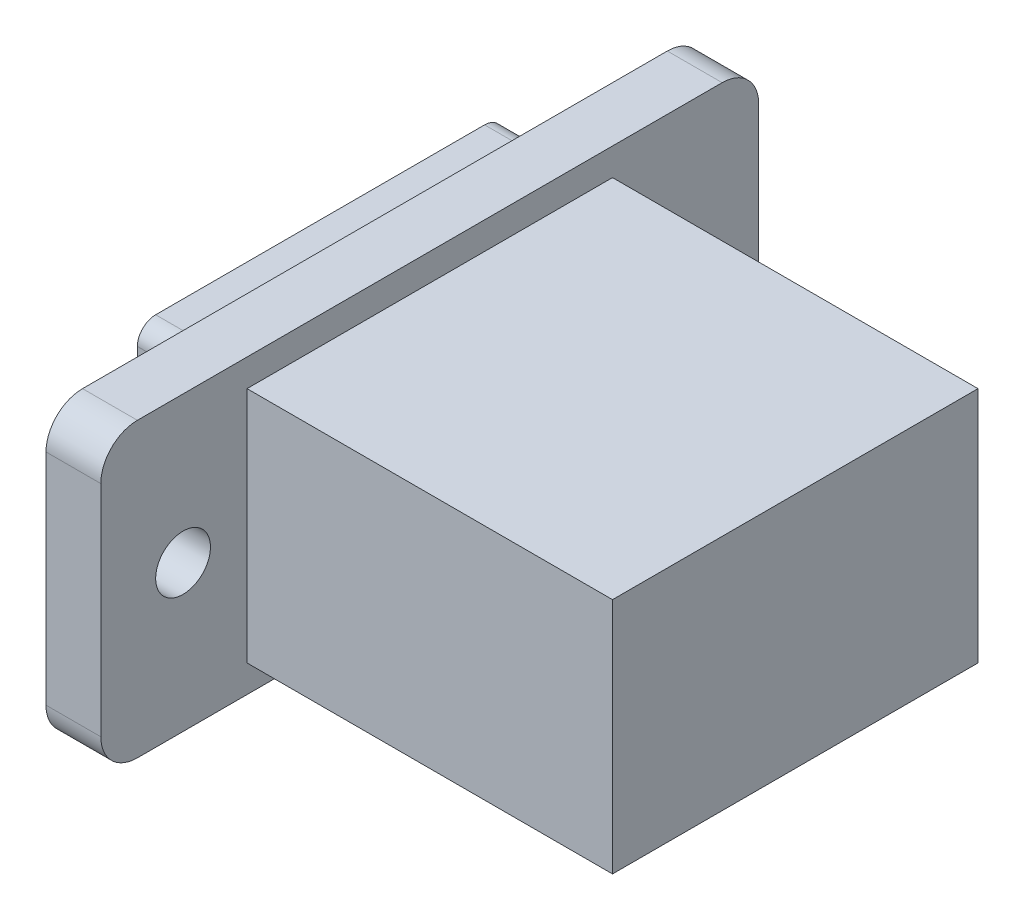
ISO-10303-21;
HEADER;
FILE_DESCRIPTION(('STEP AP214'),'2;1');
FILE_NAME('part.step','',(''),(''),'','','');
FILE_SCHEMA(('AUTOMOTIVE_DESIGN { 1 0 10303 214 1 1 1 1 }'));
ENDSEC;
DATA;
#1=APPLICATION_CONTEXT('core data for automotive mechanical design processes');
#2=APPLICATION_PROTOCOL_DEFINITION('international standard','automotive_design',2000,#1);
#3=PRODUCT_CONTEXT('',#1,'mechanical');
#4=PRODUCT('Part','Part','',(#3));
#5=PRODUCT_RELATED_PRODUCT_CATEGORY('part','',(#4));
#6=PRODUCT_DEFINITION_FORMATION('','',#4);
#7=PRODUCT_DEFINITION_CONTEXT('part definition',#1,'design');
#8=PRODUCT_DEFINITION('design','',#6,#7);
#9=PRODUCT_DEFINITION_SHAPE('','',#8);
#10=(LENGTH_UNIT() NAMED_UNIT(*) SI_UNIT(.MILLI.,.METRE.));
#11=(NAMED_UNIT(*) PLANE_ANGLE_UNIT() SI_UNIT($,.RADIAN.));
#12=(NAMED_UNIT(*) SI_UNIT($,.STERADIAN.) SOLID_ANGLE_UNIT());
#13=UNCERTAINTY_MEASURE_WITH_UNIT(LENGTH_MEASURE(1.E-05),#10,'distance_accuracy_value','');
#14=(GEOMETRIC_REPRESENTATION_CONTEXT(3) GLOBAL_UNCERTAINTY_ASSIGNED_CONTEXT((#13)) GLOBAL_UNIT_ASSIGNED_CONTEXT((#10,
#11,#12)) REPRESENTATION_CONTEXT('',''));
#15=CARTESIAN_POINT('',(0.,0.,0.));
#16=DIRECTION('',(0.,0.,1.));
#17=DIRECTION('',(1.,0.,0.));
#18=AXIS2_PLACEMENT_3D('',#15,#16,#17);
#19=CARTESIAN_POINT('',(3.,0.,0.));
#20=DIRECTION('',(-1.,0.,0.));
#21=DIRECTION('',(0.,0.,1.));
#22=AXIS2_PLACEMENT_3D('',#19,#20,#21);
#23=PLANE('',#22);
#24=CARTESIAN_POINT('',(3.,8.,-31.5));
#25=DIRECTION('',(-1.,0.,0.));
#26=DIRECTION('',(0.,0.,1.));
#27=AXIS2_PLACEMENT_3D('',#24,#25,#26);
#28=CIRCLE('',#27,1.5);
#29=CARTESIAN_POINT('',(3.,8.,-30.));
#30=VERTEX_POINT('',#29);
#31=EDGE_CURVE('E482',#30,#30,#28,.T.);
#32=ORIENTED_EDGE('',*,*,#31,.T.);
#33=EDGE_LOOP('',(#32));
#34=FACE_BOUND('',#33,.T.);
#35=CARTESIAN_POINT('',(3.,8.,-4.49999999999999));
#36=DIRECTION('',(-1.,0.,0.));
#37=DIRECTION('',(0.,0.,1.));
#38=AXIS2_PLACEMENT_3D('',#35,#36,#37);
#39=CIRCLE('',#38,1.5);
#40=CARTESIAN_POINT('',(3.,8.,-2.99999999999999));
#41=VERTEX_POINT('',#40);
#42=EDGE_CURVE('E506',#41,#41,#39,.T.);
#43=ORIENTED_EDGE('',*,*,#42,.T.);
#44=EDGE_LOOP('',(#43));
#45=FACE_BOUND('',#44,.T.);
#46=DIRECTION('',(0.,0.,-1.));
#47=VECTOR('',#46,1.);
#48=CARTESIAN_POINT('',(3.,0.,0.));
#49=LINE('',#48,#47);
#50=CARTESIAN_POINT('',(3.,0.,-2.));
#51=VERTEX_POINT('',#50);
#52=CARTESIAN_POINT('',(3.,0.,-34.));
#53=VERTEX_POINT('',#52);
#54=EDGE_CURVE('E246',#51,#53,#49,.T.);
#55=ORIENTED_EDGE('',*,*,#54,.T.);
#56=CARTESIAN_POINT('',(3.,2.,-34.));
#57=DIRECTION('',(-1.,0.,0.));
#58=DIRECTION('',(0.,0.,1.));
#59=AXIS2_PLACEMENT_3D('',#56,#57,#58);
#60=CIRCLE('',#59,2.);
#61=CARTESIAN_POINT('',(3.,2.,-36.));
#62=VERTEX_POINT('',#61);
#63=EDGE_CURVE('E308',#53,#62,#60,.F.);
#64=ORIENTED_EDGE('',*,*,#63,.T.);
#65=DIRECTION('',(0.,1.,0.));
#66=VECTOR('',#65,1.);
#67=CARTESIAN_POINT('',(3.,0.,-36.));
#68=LINE('',#67,#66);
#69=CARTESIAN_POINT('',(3.,14.,-36.));
#70=VERTEX_POINT('',#69);
#71=EDGE_CURVE('E251',#62,#70,#68,.T.);
#72=ORIENTED_EDGE('',*,*,#71,.T.);
#73=CARTESIAN_POINT('',(3.,14.,-34.));
#74=DIRECTION('',(-1.,0.,0.));
#75=DIRECTION('',(0.,0.,1.));
#76=AXIS2_PLACEMENT_3D('',#73,#74,#75);
#77=CIRCLE('',#76,2.);
#78=CARTESIAN_POINT('',(3.,16.,-34.));
#79=VERTEX_POINT('',#78);
#80=EDGE_CURVE('E305',#70,#79,#77,.F.);
#81=ORIENTED_EDGE('',*,*,#80,.T.);
#82=DIRECTION('',(0.,0.,1.));
#83=VECTOR('',#82,1.);
#84=CARTESIAN_POINT('',(3.,16.,0.));
#85=LINE('',#84,#83);
#86=CARTESIAN_POINT('',(3.,16.,-2.));
#87=VERTEX_POINT('',#86);
#88=EDGE_CURVE('E255',#79,#87,#85,.T.);
#89=ORIENTED_EDGE('',*,*,#88,.T.);
#90=CARTESIAN_POINT('',(3.,14.,-2.));
#91=DIRECTION('',(-1.,0.,0.));
#92=DIRECTION('',(0.,0.,1.));
#93=AXIS2_PLACEMENT_3D('',#90,#91,#92);
#94=CIRCLE('',#93,2.);
#95=CARTESIAN_POINT('',(3.,14.,0.));
#96=VERTEX_POINT('',#95);
#97=EDGE_CURVE('E299',#87,#96,#94,.F.);
#98=ORIENTED_EDGE('',*,*,#97,.T.);
#99=DIRECTION('',(0.,-1.,0.));
#100=VECTOR('',#99,1.);
#101=CARTESIAN_POINT('',(3.,0.,0.));
#102=LINE('',#101,#100);
#103=CARTESIAN_POINT('',(3.,2.,0.));
#104=VERTEX_POINT('',#103);
#105=EDGE_CURVE('E242',#96,#104,#102,.T.);
#106=ORIENTED_EDGE('',*,*,#105,.T.);
#107=CARTESIAN_POINT('',(3.,2.,-2.));
#108=DIRECTION('',(-1.,0.,0.));
#109=DIRECTION('',(0.,0.,1.));
#110=AXIS2_PLACEMENT_3D('',#107,#108,#109);
#111=CIRCLE('',#110,2.);
#112=EDGE_CURVE('E302',#104,#51,#111,.F.);
#113=ORIENTED_EDGE('',*,*,#112,.T.);
#114=EDGE_LOOP('',(#55,#64,#72,#81,#89,#98,#106,#113));
#115=FACE_BOUND('',#114,.T.);
#116=DIRECTION('',(0.,1.,0.));
#117=VECTOR('',#116,1.);
#118=CARTESIAN_POINT('',(3.,14.5,-28.));
#119=LINE('',#118,#117);
#120=CARTESIAN_POINT('',(3.,1.5,-28.));
#121=VERTEX_POINT('',#120);
#122=CARTESIAN_POINT('',(3.,14.5,-28.));
#123=VERTEX_POINT('',#122);
#124=EDGE_CURVE('E202',#121,#123,#119,.T.);
#125=ORIENTED_EDGE('',*,*,#124,.F.);
#126=DIRECTION('',(0.,0.,-1.));
#127=VECTOR('',#126,1.);
#128=CARTESIAN_POINT('',(3.,1.5,-28.));
#129=LINE('',#128,#127);
#130=CARTESIAN_POINT('',(3.,1.5,-8.));
#131=VERTEX_POINT('',#130);
#132=EDGE_CURVE('E199',#131,#121,#129,.T.);
#133=ORIENTED_EDGE('',*,*,#132,.F.);
#134=DIRECTION('',(0.,-1.,0.));
#135=VECTOR('',#134,1.);
#136=CARTESIAN_POINT('',(3.,1.5,-8.));
#137=LINE('',#136,#135);
#138=CARTESIAN_POINT('',(3.,14.5,-8.));
#139=VERTEX_POINT('',#138);
#140=EDGE_CURVE('E490',#139,#131,#137,.T.);
#141=ORIENTED_EDGE('',*,*,#140,.F.);
#142=DIRECTION('',(0.,0.,1.));
#143=VECTOR('',#142,1.);
#144=CARTESIAN_POINT('',(3.,14.5,-8.));
#145=LINE('',#144,#143);
#146=EDGE_CURVE('E480',#123,#139,#145,.T.);
#147=ORIENTED_EDGE('',*,*,#146,.F.);
#148=EDGE_LOOP('',(#125,#133,#141,#147));
#149=FACE_BOUND('',#148,.T.);
#150=ADVANCED_FACE('F39',(#34,#45,#115,#149),#23,.F.);
#151=CARTESIAN_POINT('',(3.,0.,0.));
#152=DIRECTION('',(0.,0.,-1.));
#153=DIRECTION('',(-1.,0.,0.));
#154=AXIS2_PLACEMENT_3D('',#151,#152,#153);
#155=PLANE('',#154);
#156=DIRECTION('',(0.,-1.,0.));
#157=VECTOR('',#156,1.);
#158=CARTESIAN_POINT('',(0.,0.,0.));
#159=LINE('',#158,#157);
#160=CARTESIAN_POINT('',(0.,14.,0.));
#161=VERTEX_POINT('',#160);
#162=CARTESIAN_POINT('',(0.,2.,0.));
#163=VERTEX_POINT('',#162);
#164=EDGE_CURVE('E231',#161,#163,#159,.T.);
#165=ORIENTED_EDGE('',*,*,#164,.T.);
#166=DIRECTION('',(-1.,0.,0.));
#167=VECTOR('',#166,1.);
#168=CARTESIAN_POINT('',(3.,2.,0.));
#169=LINE('',#168,#167);
#170=EDGE_CURVE('E322',#163,#104,#169,.F.);
#171=ORIENTED_EDGE('',*,*,#170,.T.);
#172=ORIENTED_EDGE('',*,*,#105,.F.);
#173=DIRECTION('',(-1.,0.,0.));
#174=VECTOR('',#173,1.);
#175=CARTESIAN_POINT('',(3.,14.,0.));
#176=LINE('',#175,#174);
#177=EDGE_CURVE('E318',#96,#161,#176,.T.);
#178=ORIENTED_EDGE('',*,*,#177,.T.);
#179=EDGE_LOOP('',(#165,#171,#172,#178));
#180=FACE_BOUND('',#179,.T.);
#181=ADVANCED_FACE('F416',(#180),#155,.F.);
#182=CARTESIAN_POINT('',(3.,0.,0.));
#183=DIRECTION('',(0.,1.,0.));
#184=DIRECTION('',(0.,0.,1.));
#185=AXIS2_PLACEMENT_3D('',#182,#183,#184);
#186=PLANE('',#185);
#187=DIRECTION('',(0.,0.,-1.));
#188=VECTOR('',#187,1.);
#189=CARTESIAN_POINT('',(0.,0.,0.));
#190=LINE('',#189,#188);
#191=CARTESIAN_POINT('',(0.,0.,-2.));
#192=VERTEX_POINT('',#191);
#193=CARTESIAN_POINT('',(0.,0.,-34.));
#194=VERTEX_POINT('',#193);
#195=EDGE_CURVE('E263',#192,#194,#190,.T.);
#196=ORIENTED_EDGE('',*,*,#195,.T.);
#197=DIRECTION('',(-1.,0.,0.));
#198=VECTOR('',#197,1.);
#199=CARTESIAN_POINT('',(3.,0.,-34.));
#200=LINE('',#199,#198);
#201=EDGE_CURVE('E296',#194,#53,#200,.F.);
#202=ORIENTED_EDGE('',*,*,#201,.T.);
#203=ORIENTED_EDGE('',*,*,#54,.F.);
#204=DIRECTION('',(-1.,0.,0.));
#205=VECTOR('',#204,1.);
#206=CARTESIAN_POINT('',(3.,0.,-2.));
#207=LINE('',#206,#205);
#208=EDGE_CURVE('E292',#51,#192,#207,.T.);
#209=ORIENTED_EDGE('',*,*,#208,.T.);
#210=EDGE_LOOP('',(#196,#202,#203,#209));
#211=FACE_BOUND('',#210,.T.);
#212=ADVANCED_FACE('F422',(#211),#186,.F.);
#213=CARTESIAN_POINT('',(3.,0.,-36.));
#214=DIRECTION('',(0.,0.,1.));
#215=DIRECTION('',(1.,0.,0.));
#216=AXIS2_PLACEMENT_3D('',#213,#214,#215);
#217=PLANE('',#216);
#218=ORIENTED_EDGE('',*,*,#71,.F.);
#219=DIRECTION('',(-1.,0.,0.));
#220=VECTOR('',#219,1.);
#221=CARTESIAN_POINT('',(3.,2.,-36.));
#222=LINE('',#221,#220);
#223=CARTESIAN_POINT('',(0.,2.,-36.));
#224=VERTEX_POINT('',#223);
#225=EDGE_CURVE('E276',#62,#224,#222,.T.);
#226=ORIENTED_EDGE('',*,*,#225,.T.);
#227=DIRECTION('',(0.,1.,0.));
#228=VECTOR('',#227,1.);
#229=CARTESIAN_POINT('',(0.,0.,-36.));
#230=LINE('',#229,#228);
#231=CARTESIAN_POINT('',(0.,14.,-36.));
#232=VERTEX_POINT('',#231);
#233=EDGE_CURVE('E267',#224,#232,#230,.T.);
#234=ORIENTED_EDGE('',*,*,#233,.T.);
#235=DIRECTION('',(-1.,0.,0.));
#236=VECTOR('',#235,1.);
#237=CARTESIAN_POINT('',(3.,14.,-36.));
#238=LINE('',#237,#236);
#239=EDGE_CURVE('E259',#232,#70,#238,.F.);
#240=ORIENTED_EDGE('',*,*,#239,.T.);
#241=EDGE_LOOP('',(#218,#226,#234,#240));
#242=FACE_BOUND('',#241,.T.);
#243=ADVANCED_FACE('F436',(#242),#217,.F.);
#244=CARTESIAN_POINT('',(3.,16.,0.));
#245=DIRECTION('',(0.,-1.,0.));
#246=DIRECTION('',(0.,0.,-1.));
#247=AXIS2_PLACEMENT_3D('',#244,#245,#246);
#248=PLANE('',#247);
#249=ORIENTED_EDGE('',*,*,#88,.F.);
#250=DIRECTION('',(-1.,0.,0.));
#251=VECTOR('',#250,1.);
#252=CARTESIAN_POINT('',(3.,16.,-34.));
#253=LINE('',#252,#251);
#254=CARTESIAN_POINT('',(0.,16.,-34.));
#255=VERTEX_POINT('',#254);
#256=EDGE_CURVE('E314',#79,#255,#253,.T.);
#257=ORIENTED_EDGE('',*,*,#256,.T.);
#258=DIRECTION('',(0.,0.,1.));
#259=VECTOR('',#258,1.);
#260=CARTESIAN_POINT('',(0.,16.,0.));
#261=LINE('',#260,#259);
#262=CARTESIAN_POINT('',(0.,16.,-2.));
#263=VERTEX_POINT('',#262);
#264=EDGE_CURVE('E247',#255,#263,#261,.T.);
#265=ORIENTED_EDGE('',*,*,#264,.T.);
#266=DIRECTION('',(-1.,0.,0.));
#267=VECTOR('',#266,1.);
#268=CARTESIAN_POINT('',(3.,16.,-2.));
#269=LINE('',#268,#267);
#270=EDGE_CURVE('E311',#263,#87,#269,.F.);
#271=ORIENTED_EDGE('',*,*,#270,.T.);
#272=EDGE_LOOP('',(#249,#257,#265,#271));
#273=FACE_BOUND('',#272,.T.);
#274=ADVANCED_FACE('F432',(#273),#248,.F.);
#275=CARTESIAN_POINT('',(0.,0.,0.));
#276=DIRECTION('',(-1.,0.,0.));
#277=DIRECTION('',(0.,0.,1.));
#278=AXIS2_PLACEMENT_3D('',#275,#276,#277);
#279=PLANE('',#278);
#280=CARTESIAN_POINT('',(0.,8.,-31.5));
#281=DIRECTION('',(-1.,0.,0.));
#282=DIRECTION('',(0.,0.,1.));
#283=AXIS2_PLACEMENT_3D('',#280,#281,#282);
#284=CIRCLE('',#283,1.5);
#285=CARTESIAN_POINT('',(0.,8.,-30.));
#286=VERTEX_POINT('',#285);
#287=EDGE_CURVE('E510',#286,#286,#284,.T.);
#288=ORIENTED_EDGE('',*,*,#287,.F.);
#289=EDGE_LOOP('',(#288));
#290=FACE_BOUND('',#289,.T.);
#291=CARTESIAN_POINT('',(0.,8.,-4.49999999999999));
#292=DIRECTION('',(-1.,0.,0.));
#293=DIRECTION('',(0.,0.,-1.));
#294=AXIS2_PLACEMENT_3D('',#291,#292,#293);
#295=CIRCLE('',#294,1.5);
#296=CARTESIAN_POINT('',(0.,8.,-6.));
#297=VERTEX_POINT('',#296);
#298=EDGE_CURVE('E511',#297,#297,#295,.T.);
#299=ORIENTED_EDGE('',*,*,#298,.F.);
#300=EDGE_LOOP('',(#299));
#301=FACE_BOUND('',#300,.T.);
#302=DIRECTION('',(0.,-1.,0.));
#303=VECTOR('',#302,1.);
#304=CARTESIAN_POINT('',(0.,14.5,-28.));
#305=LINE('',#304,#303);
#306=CARTESIAN_POINT('',(0.,13.5,-28.));
#307=VERTEX_POINT('',#306);
#308=CARTESIAN_POINT('',(0.,2.5,-28.));
#309=VERTEX_POINT('',#308);
#310=EDGE_CURVE('E204',#307,#309,#305,.T.);
#311=ORIENTED_EDGE('',*,*,#310,.F.);
#312=CARTESIAN_POINT('',(0.,13.5,-27.));
#313=DIRECTION('',(-1.,0.,0.));
#314=DIRECTION('',(0.,0.,1.));
#315=AXIS2_PLACEMENT_3D('',#312,#313,#314);
#316=CIRCLE('',#315,1.);
#317=CARTESIAN_POINT('',(0.,14.5,-27.));
#318=VERTEX_POINT('',#317);
#319=EDGE_CURVE('E367',#307,#318,#316,.F.);
#320=ORIENTED_EDGE('',*,*,#319,.T.);
#321=DIRECTION('',(0.,0.,-1.));
#322=VECTOR('',#321,1.);
#323=CARTESIAN_POINT('',(0.,14.5,-28.));
#324=LINE('',#323,#322);
#325=CARTESIAN_POINT('',(0.,14.5,-9.));
#326=VERTEX_POINT('',#325);
#327=EDGE_CURVE('E220',#326,#318,#324,.T.);
#328=ORIENTED_EDGE('',*,*,#327,.F.);
#329=CARTESIAN_POINT('',(0.,13.5,-9.));
#330=DIRECTION('',(-1.,0.,0.));
#331=DIRECTION('',(0.,0.,1.));
#332=AXIS2_PLACEMENT_3D('',#329,#330,#331);
#333=CIRCLE('',#332,1.);
#334=CARTESIAN_POINT('',(0.,13.5,-8.));
#335=VERTEX_POINT('',#334);
#336=EDGE_CURVE('E11',#326,#335,#333,.F.);
#337=ORIENTED_EDGE('',*,*,#336,.T.);
#338=DIRECTION('',(0.,1.,0.));
#339=VECTOR('',#338,1.);
#340=CARTESIAN_POINT('',(0.,14.5,-8.));
#341=LINE('',#340,#339);
#342=CARTESIAN_POINT('',(0.,2.5,-8.));
#343=VERTEX_POINT('',#342);
#344=EDGE_CURVE('E236',#343,#335,#341,.T.);
#345=ORIENTED_EDGE('',*,*,#344,.F.);
#346=CARTESIAN_POINT('',(0.,2.5,-9.));
#347=DIRECTION('',(-1.,0.,0.));
#348=DIRECTION('',(0.,0.,1.));
#349=AXIS2_PLACEMENT_3D('',#346,#347,#348);
#350=CIRCLE('',#349,1.);
#351=CARTESIAN_POINT('',(0.,1.5,-8.99999999999999));
#352=VERTEX_POINT('',#351);
#353=EDGE_CURVE('E48',#343,#352,#350,.F.);
#354=ORIENTED_EDGE('',*,*,#353,.T.);
#355=DIRECTION('',(0.,0.,1.));
#356=VECTOR('',#355,1.);
#357=CARTESIAN_POINT('',(0.,1.5,-28.));
#358=LINE('',#357,#356);
#359=CARTESIAN_POINT('',(0.,1.5,-27.));
#360=VERTEX_POINT('',#359);
#361=EDGE_CURVE('E209',#360,#352,#358,.T.);
#362=ORIENTED_EDGE('',*,*,#361,.F.);
#363=CARTESIAN_POINT('',(0.,2.5,-27.));
#364=DIRECTION('',(-1.,0.,0.));
#365=DIRECTION('',(0.,0.,1.));
#366=AXIS2_PLACEMENT_3D('',#363,#364,#365);
#367=CIRCLE('',#366,1.);
#368=EDGE_CURVE('E364',#360,#309,#367,.F.);
#369=ORIENTED_EDGE('',*,*,#368,.T.);
#370=EDGE_LOOP('',(#311,#320,#328,#337,#345,#354,#362,#369));
#371=FACE_BOUND('',#370,.T.);
#372=ORIENTED_EDGE('',*,*,#233,.F.);
#373=CARTESIAN_POINT('',(0.,2.,-34.));
#374=DIRECTION('',(-1.,0.,0.));
#375=DIRECTION('',(0.,0.,1.));
#376=AXIS2_PLACEMENT_3D('',#373,#374,#375);
#377=CIRCLE('',#376,2.);
#378=EDGE_CURVE('E289',#224,#194,#377,.T.);
#379=ORIENTED_EDGE('',*,*,#378,.T.);
#380=ORIENTED_EDGE('',*,*,#195,.F.);
#381=CARTESIAN_POINT('',(0.,2.,-2.));
#382=DIRECTION('',(-1.,0.,0.));
#383=DIRECTION('',(0.,0.,1.));
#384=AXIS2_PLACEMENT_3D('',#381,#382,#383);
#385=CIRCLE('',#384,2.);
#386=EDGE_CURVE('E283',#192,#163,#385,.T.);
#387=ORIENTED_EDGE('',*,*,#386,.T.);
#388=ORIENTED_EDGE('',*,*,#164,.F.);
#389=CARTESIAN_POINT('',(0.,14.,-2.));
#390=DIRECTION('',(-1.,0.,0.));
#391=DIRECTION('',(0.,0.,1.));
#392=AXIS2_PLACEMENT_3D('',#389,#390,#391);
#393=CIRCLE('',#392,2.);
#394=EDGE_CURVE('E280',#161,#263,#393,.T.);
#395=ORIENTED_EDGE('',*,*,#394,.T.);
#396=ORIENTED_EDGE('',*,*,#264,.F.);
#397=CARTESIAN_POINT('',(0.,14.,-34.));
#398=DIRECTION('',(-1.,0.,0.));
#399=DIRECTION('',(0.,0.,1.));
#400=AXIS2_PLACEMENT_3D('',#397,#398,#399);
#401=CIRCLE('',#400,2.);
#402=EDGE_CURVE('E286',#255,#232,#401,.T.);
#403=ORIENTED_EDGE('',*,*,#402,.T.);
#404=EDGE_LOOP('',(#372,#379,#380,#387,#388,#395,#396,#403));
#405=FACE_BOUND('',#404,.T.);
#406=ADVANCED_FACE('F372',(#290,#301,#371,#405),#279,.T.);
#407=CARTESIAN_POINT('',(-3.,14.5,-28.));
#408=DIRECTION('',(0.,0.,1.));
#409=DIRECTION('',(1.,0.,0.));
#410=AXIS2_PLACEMENT_3D('',#407,#408,#409);
#411=PLANE('',#410);
#412=ORIENTED_EDGE('',*,*,#310,.T.);
#413=DIRECTION('',(1.,0.,0.));
#414=VECTOR('',#413,1.);
#415=CARTESIAN_POINT('',(-3.,2.5,-28.));
#416=LINE('',#415,#414);
#417=CARTESIAN_POINT('',(-3.,2.5,-28.));
#418=VERTEX_POINT('',#417);
#419=EDGE_CURVE('E336',#309,#418,#416,.F.);
#420=ORIENTED_EDGE('',*,*,#419,.T.);
#421=DIRECTION('',(0.,-1.,0.));
#422=VECTOR('',#421,1.);
#423=CARTESIAN_POINT('',(-3.,14.5,-28.));
#424=LINE('',#423,#422);
#425=CARTESIAN_POINT('',(-3.,13.5,-28.));
#426=VERTEX_POINT('',#425);
#427=EDGE_CURVE('E215',#426,#418,#424,.T.);
#428=ORIENTED_EDGE('',*,*,#427,.F.);
#429=DIRECTION('',(1.,0.,0.));
#430=VECTOR('',#429,1.);
#431=CARTESIAN_POINT('',(-3.,13.5,-28.));
#432=LINE('',#431,#430);
#433=EDGE_CURVE('E332',#426,#307,#432,.T.);
#434=ORIENTED_EDGE('',*,*,#433,.T.);
#435=EDGE_LOOP('',(#412,#420,#428,#434));
#436=FACE_BOUND('',#435,.T.);
#437=ADVANCED_FACE('F400',(#436),#411,.F.);
#438=CARTESIAN_POINT('',(-3.,1.5,-28.));
#439=DIRECTION('',(0.,1.,0.));
#440=DIRECTION('',(0.,0.,1.));
#441=AXIS2_PLACEMENT_3D('',#438,#439,#440);
#442=PLANE('',#441);
#443=DIRECTION('',(0.,0.,1.));
#444=VECTOR('',#443,1.);
#445=CARTESIAN_POINT('',(-3.,1.5,-28.));
#446=LINE('',#445,#444);
#447=CARTESIAN_POINT('',(-3.,1.5,-27.));
#448=VERTEX_POINT('',#447);
#449=CARTESIAN_POINT('',(-3.,1.5,-8.99999999999999));
#450=VERTEX_POINT('',#449);
#451=EDGE_CURVE('E219',#448,#450,#446,.T.);
#452=ORIENTED_EDGE('',*,*,#451,.F.);
#453=DIRECTION('',(1.,0.,0.));
#454=VECTOR('',#453,1.);
#455=CARTESIAN_POINT('',(-3.,1.5,-27.));
#456=LINE('',#455,#454);
#457=EDGE_CURVE('E328',#448,#360,#456,.T.);
#458=ORIENTED_EDGE('',*,*,#457,.T.);
#459=ORIENTED_EDGE('',*,*,#361,.T.);
#460=DIRECTION('',(1.,0.,0.));
#461=VECTOR('',#460,1.);
#462=CARTESIAN_POINT('',(-3.,1.5,-8.99999999999999));
#463=LINE('',#462,#461);
#464=EDGE_CURVE('E325',#352,#450,#463,.F.);
#465=ORIENTED_EDGE('',*,*,#464,.T.);
#466=EDGE_LOOP('',(#452,#458,#459,#465));
#467=FACE_BOUND('',#466,.T.);
#468=ADVANCED_FACE('F376',(#467),#442,.F.);
#469=CARTESIAN_POINT('',(-3.,14.5,-8.));
#470=DIRECTION('',(0.,0.,-1.));
#471=DIRECTION('',(0.,1.,0.));
#472=AXIS2_PLACEMENT_3D('',#469,#470,#471);
#473=PLANE('',#472);
#474=DIRECTION('',(0.,1.,0.));
#475=VECTOR('',#474,1.);
#476=CARTESIAN_POINT('',(-3.,14.5,-8.));
#477=LINE('',#476,#475);
#478=CARTESIAN_POINT('',(-3.,2.5,-8.));
#479=VERTEX_POINT('',#478);
#480=CARTESIAN_POINT('',(-3.,13.5,-8.));
#481=VERTEX_POINT('',#480);
#482=EDGE_CURVE('E224',#479,#481,#477,.T.);
#483=ORIENTED_EDGE('',*,*,#482,.F.);
#484=DIRECTION('',(1.,0.,0.));
#485=VECTOR('',#484,1.);
#486=CARTESIAN_POINT('',(-3.,2.5,-8.));
#487=LINE('',#486,#485);
#488=EDGE_CURVE('E361',#479,#343,#487,.T.);
#489=ORIENTED_EDGE('',*,*,#488,.T.);
#490=ORIENTED_EDGE('',*,*,#344,.T.);
#491=DIRECTION('',(1.,0.,0.));
#492=VECTOR('',#491,1.);
#493=CARTESIAN_POINT('',(-3.,13.5,-8.));
#494=LINE('',#493,#492);
#495=EDGE_CURVE('E358',#335,#481,#494,.F.);
#496=ORIENTED_EDGE('',*,*,#495,.T.);
#497=EDGE_LOOP('',(#483,#489,#490,#496));
#498=FACE_BOUND('',#497,.T.);
#499=ADVANCED_FACE('F385',(#498),#473,.F.);
#500=CARTESIAN_POINT('',(-3.,14.5,-28.));
#501=DIRECTION('',(0.,-1.,0.));
#502=DIRECTION('',(0.,0.,-1.));
#503=AXIS2_PLACEMENT_3D('',#500,#501,#502);
#504=PLANE('',#503);
#505=ORIENTED_EDGE('',*,*,#327,.T.);
#506=DIRECTION('',(1.,0.,0.));
#507=VECTOR('',#506,1.);
#508=CARTESIAN_POINT('',(-3.,14.5,-27.));
#509=LINE('',#508,#507);
#510=CARTESIAN_POINT('',(-3.,14.5,-27.));
#511=VERTEX_POINT('',#510);
#512=EDGE_CURVE('E355',#318,#511,#509,.F.);
#513=ORIENTED_EDGE('',*,*,#512,.T.);
#514=DIRECTION('',(0.,0.,-1.));
#515=VECTOR('',#514,1.);
#516=CARTESIAN_POINT('',(-3.,14.5,-28.));
#517=LINE('',#516,#515);
#518=CARTESIAN_POINT('',(-3.,14.5,-9.));
#519=VERTEX_POINT('',#518);
#520=EDGE_CURVE('E228',#519,#511,#517,.T.);
#521=ORIENTED_EDGE('',*,*,#520,.F.);
#522=DIRECTION('',(1.,0.,0.));
#523=VECTOR('',#522,1.);
#524=CARTESIAN_POINT('',(-3.,14.5,-9.));
#525=LINE('',#524,#523);
#526=EDGE_CURVE('E351',#519,#326,#525,.T.);
#527=ORIENTED_EDGE('',*,*,#526,.T.);
#528=EDGE_LOOP('',(#505,#513,#521,#527));
#529=FACE_BOUND('',#528,.T.);
#530=ADVANCED_FACE('F392',(#529),#504,.F.);
#531=CARTESIAN_POINT('',(-3.,0.,0.));
#532=DIRECTION('',(-1.,0.,0.));
#533=DIRECTION('',(0.,0.,1.));
#534=AXIS2_PLACEMENT_3D('',#531,#532,#533);
#535=PLANE('',#534);
#536=ORIENTED_EDGE('',*,*,#427,.T.);
#537=CARTESIAN_POINT('',(-3.,2.5,-27.));
#538=DIRECTION('',(-1.,0.,0.));
#539=DIRECTION('',(0.,0.,1.));
#540=AXIS2_PLACEMENT_3D('',#537,#538,#539);
#541=CIRCLE('',#540,1.);
#542=EDGE_CURVE('E348',#418,#448,#541,.T.);
#543=ORIENTED_EDGE('',*,*,#542,.T.);
#544=ORIENTED_EDGE('',*,*,#451,.T.);
#545=CARTESIAN_POINT('',(-3.,2.5,-9.));
#546=DIRECTION('',(-1.,0.,0.));
#547=DIRECTION('',(0.,0.,1.));
#548=AXIS2_PLACEMENT_3D('',#545,#546,#547);
#549=CIRCLE('',#548,1.);
#550=EDGE_CURVE('E342',#450,#479,#549,.T.);
#551=ORIENTED_EDGE('',*,*,#550,.T.);
#552=ORIENTED_EDGE('',*,*,#482,.T.);
#553=CARTESIAN_POINT('',(-3.,13.5,-9.));
#554=DIRECTION('',(-1.,0.,0.));
#555=DIRECTION('',(0.,0.,1.));
#556=AXIS2_PLACEMENT_3D('',#553,#554,#555);
#557=CIRCLE('',#556,1.);
#558=EDGE_CURVE('E339',#481,#519,#557,.T.);
#559=ORIENTED_EDGE('',*,*,#558,.T.);
#560=ORIENTED_EDGE('',*,*,#520,.T.);
#561=CARTESIAN_POINT('',(-3.,13.5,-27.));
#562=DIRECTION('',(-1.,0.,0.));
#563=DIRECTION('',(0.,0.,1.));
#564=AXIS2_PLACEMENT_3D('',#561,#562,#563);
#565=CIRCLE('',#564,1.);
#566=EDGE_CURVE('E345',#511,#426,#565,.T.);
#567=ORIENTED_EDGE('',*,*,#566,.T.);
#568=EDGE_LOOP('',(#536,#543,#544,#551,#552,#559,#560,#567));
#569=FACE_BOUND('',#568,.T.);
#570=ADVANCED_FACE('F382',(#569),#535,.T.);
#571=CARTESIAN_POINT('',(23.,14.5,-28.));
#572=DIRECTION('',(0.,0.,1.));
#573=DIRECTION('',(1.,0.,0.));
#574=AXIS2_PLACEMENT_3D('',#571,#572,#573);
#575=PLANE('',#574);
#576=ORIENTED_EDGE('',*,*,#124,.T.);
#577=DIRECTION('',(-1.,0.,0.));
#578=VECTOR('',#577,1.);
#579=CARTESIAN_POINT('',(23.,14.5,-28.));
#580=LINE('',#579,#578);
#581=CARTESIAN_POINT('',(23.,14.5,-28.));
#582=VERTEX_POINT('',#581);
#583=EDGE_CURVE('E181',#582,#123,#580,.T.);
#584=ORIENTED_EDGE('',*,*,#583,.F.);
#585=DIRECTION('',(0.,1.,0.));
#586=VECTOR('',#585,1.);
#587=CARTESIAN_POINT('',(23.,14.5,-28.));
#588=LINE('',#587,#586);
#589=CARTESIAN_POINT('',(23.,1.5,-28.));
#590=VERTEX_POINT('',#589);
#591=EDGE_CURVE('E189',#590,#582,#588,.T.);
#592=ORIENTED_EDGE('',*,*,#591,.F.);
#593=DIRECTION('',(-1.,0.,0.));
#594=VECTOR('',#593,1.);
#595=CARTESIAN_POINT('',(23.,1.5,-28.));
#596=LINE('',#595,#594);
#597=EDGE_CURVE('E487',#590,#121,#596,.T.);
#598=ORIENTED_EDGE('',*,*,#597,.T.);
#599=EDGE_LOOP('',(#576,#584,#592,#598));
#600=FACE_BOUND('',#599,.T.);
#601=ADVANCED_FACE('F201',(#600),#575,.F.);
#602=CARTESIAN_POINT('',(23.,14.5,-8.));
#603=DIRECTION('',(0.,-1.,0.));
#604=DIRECTION('',(0.,0.,-1.));
#605=AXIS2_PLACEMENT_3D('',#602,#603,#604);
#606=PLANE('',#605);
#607=ORIENTED_EDGE('',*,*,#146,.T.);
#608=DIRECTION('',(-1.,0.,0.));
#609=VECTOR('',#608,1.);
#610=CARTESIAN_POINT('',(23.,14.5,-8.));
#611=LINE('',#610,#609);
#612=CARTESIAN_POINT('',(23.,14.5,-8.));
#613=VERTEX_POINT('',#612);
#614=EDGE_CURVE('E184',#613,#139,#611,.T.);
#615=ORIENTED_EDGE('',*,*,#614,.F.);
#616=DIRECTION('',(0.,0.,1.));
#617=VECTOR('',#616,1.);
#618=CARTESIAN_POINT('',(23.,14.5,-8.));
#619=LINE('',#618,#617);
#620=EDGE_CURVE('E176',#582,#613,#619,.T.);
#621=ORIENTED_EDGE('',*,*,#620,.F.);
#622=ORIENTED_EDGE('',*,*,#583,.T.);
#623=EDGE_LOOP('',(#607,#615,#621,#622));
#624=FACE_BOUND('',#623,.T.);
#625=ADVANCED_FACE('F179',(#624),#606,.F.);
#626=CARTESIAN_POINT('',(23.,1.5,-8.));
#627=DIRECTION('',(0.,0.,-1.));
#628=DIRECTION('',(0.,1.,0.));
#629=AXIS2_PLACEMENT_3D('',#626,#627,#628);
#630=PLANE('',#629);
#631=ORIENTED_EDGE('',*,*,#140,.T.);
#632=DIRECTION('',(-1.,0.,0.));
#633=VECTOR('',#632,1.);
#634=CARTESIAN_POINT('',(23.,1.5,-8.));
#635=LINE('',#634,#633);
#636=CARTESIAN_POINT('',(23.,1.5,-8.));
#637=VERTEX_POINT('',#636);
#638=EDGE_CURVE('E211',#637,#131,#635,.T.);
#639=ORIENTED_EDGE('',*,*,#638,.F.);
#640=DIRECTION('',(0.,-1.,0.));
#641=VECTOR('',#640,1.);
#642=CARTESIAN_POINT('',(23.,1.5,-8.));
#643=LINE('',#642,#641);
#644=EDGE_CURVE('E188',#613,#637,#643,.T.);
#645=ORIENTED_EDGE('',*,*,#644,.F.);
#646=ORIENTED_EDGE('',*,*,#614,.T.);
#647=EDGE_LOOP('',(#631,#639,#645,#646));
#648=FACE_BOUND('',#647,.T.);
#649=ADVANCED_FACE('F539',(#648),#630,.F.);
#650=CARTESIAN_POINT('',(23.,1.5,-28.));
#651=DIRECTION('',(0.,1.,0.));
#652=DIRECTION('',(0.,0.,1.));
#653=AXIS2_PLACEMENT_3D('',#650,#651,#652);
#654=PLANE('',#653);
#655=ORIENTED_EDGE('',*,*,#132,.T.);
#656=ORIENTED_EDGE('',*,*,#597,.F.);
#657=DIRECTION('',(0.,0.,-1.));
#658=VECTOR('',#657,1.);
#659=CARTESIAN_POINT('',(23.,1.5,-28.));
#660=LINE('',#659,#658);
#661=EDGE_CURVE('E194',#637,#590,#660,.T.);
#662=ORIENTED_EDGE('',*,*,#661,.F.);
#663=ORIENTED_EDGE('',*,*,#638,.T.);
#664=EDGE_LOOP('',(#655,#656,#662,#663));
#665=FACE_BOUND('',#664,.T.);
#666=ADVANCED_FACE('F486',(#665),#654,.F.);
#667=CARTESIAN_POINT('',(23.,0.,0.));
#668=DIRECTION('',(-1.,0.,0.));
#669=DIRECTION('',(0.,0.,1.));
#670=AXIS2_PLACEMENT_3D('',#667,#668,#669);
#671=PLANE('',#670);
#672=ORIENTED_EDGE('',*,*,#591,.T.);
#673=ORIENTED_EDGE('',*,*,#620,.T.);
#674=ORIENTED_EDGE('',*,*,#644,.T.);
#675=ORIENTED_EDGE('',*,*,#661,.T.);
#676=EDGE_LOOP('',(#672,#673,#674,#675));
#677=FACE_BOUND('',#676,.T.);
#678=ADVANCED_FACE('F192',(#677),#671,.F.);
#679=CARTESIAN_POINT('',(3.,2.,-34.));
#680=DIRECTION('',(-1.,0.,0.));
#681=DIRECTION('',(0.,0.,1.));
#682=AXIS2_PLACEMENT_3D('',#679,#680,#681);
#683=CYLINDRICAL_SURFACE('',#682,2.);
#684=ORIENTED_EDGE('',*,*,#63,.F.);
#685=ORIENTED_EDGE('',*,*,#201,.F.);
#686=ORIENTED_EDGE('',*,*,#378,.F.);
#687=ORIENTED_EDGE('',*,*,#225,.F.);
#688=EDGE_LOOP('',(#684,#685,#686,#687));
#689=FACE_BOUND('',#688,.T.);
#690=ADVANCED_FACE('F444',(#689),#683,.T.);
#691=CARTESIAN_POINT('',(3.,14.,-34.));
#692=DIRECTION('',(-1.,0.,0.));
#693=DIRECTION('',(0.,0.,1.));
#694=AXIS2_PLACEMENT_3D('',#691,#692,#693);
#695=CYLINDRICAL_SURFACE('',#694,2.);
#696=ORIENTED_EDGE('',*,*,#80,.F.);
#697=ORIENTED_EDGE('',*,*,#239,.F.);
#698=ORIENTED_EDGE('',*,*,#402,.F.);
#699=ORIENTED_EDGE('',*,*,#256,.F.);
#700=EDGE_LOOP('',(#696,#697,#698,#699));
#701=FACE_BOUND('',#700,.T.);
#702=ADVANCED_FACE('F447',(#701),#695,.T.);
#703=CARTESIAN_POINT('',(3.,2.,-2.));
#704=DIRECTION('',(-1.,0.,0.));
#705=DIRECTION('',(0.,0.,1.));
#706=AXIS2_PLACEMENT_3D('',#703,#704,#705);
#707=CYLINDRICAL_SURFACE('',#706,2.);
#708=ORIENTED_EDGE('',*,*,#112,.F.);
#709=ORIENTED_EDGE('',*,*,#170,.F.);
#710=ORIENTED_EDGE('',*,*,#386,.F.);
#711=ORIENTED_EDGE('',*,*,#208,.F.);
#712=EDGE_LOOP('',(#708,#709,#710,#711));
#713=FACE_BOUND('',#712,.T.);
#714=ADVANCED_FACE('F412',(#713),#707,.T.);
#715=CARTESIAN_POINT('',(3.,14.,-2.));
#716=DIRECTION('',(-1.,0.,0.));
#717=DIRECTION('',(0.,0.,1.));
#718=AXIS2_PLACEMENT_3D('',#715,#716,#717);
#719=CYLINDRICAL_SURFACE('',#718,2.);
#720=ORIENTED_EDGE('',*,*,#97,.F.);
#721=ORIENTED_EDGE('',*,*,#270,.F.);
#722=ORIENTED_EDGE('',*,*,#394,.F.);
#723=ORIENTED_EDGE('',*,*,#177,.F.);
#724=EDGE_LOOP('',(#720,#721,#722,#723));
#725=FACE_BOUND('',#724,.T.);
#726=ADVANCED_FACE('F405',(#725),#719,.T.);
#727=CARTESIAN_POINT('',(-3.,2.5,-27.));
#728=DIRECTION('',(1.,0.,0.));
#729=DIRECTION('',(0.,0.,-1.));
#730=AXIS2_PLACEMENT_3D('',#727,#728,#729);
#731=CYLINDRICAL_SURFACE('',#730,1.);
#732=ORIENTED_EDGE('',*,*,#542,.F.);
#733=ORIENTED_EDGE('',*,*,#419,.F.);
#734=ORIENTED_EDGE('',*,*,#368,.F.);
#735=ORIENTED_EDGE('',*,*,#457,.F.);
#736=EDGE_LOOP('',(#732,#733,#734,#735));
#737=FACE_BOUND('',#736,.T.);
#738=ADVANCED_FACE('F403',(#737),#731,.T.);
#739=CARTESIAN_POINT('',(-3.,13.5,-27.));
#740=DIRECTION('',(1.,0.,0.));
#741=DIRECTION('',(0.,0.,-1.));
#742=AXIS2_PLACEMENT_3D('',#739,#740,#741);
#743=CYLINDRICAL_SURFACE('',#742,1.);
#744=ORIENTED_EDGE('',*,*,#566,.F.);
#745=ORIENTED_EDGE('',*,*,#512,.F.);
#746=ORIENTED_EDGE('',*,*,#319,.F.);
#747=ORIENTED_EDGE('',*,*,#433,.F.);
#748=EDGE_LOOP('',(#744,#745,#746,#747));
#749=FACE_BOUND('',#748,.T.);
#750=ADVANCED_FACE('F395',(#749),#743,.T.);
#751=CARTESIAN_POINT('',(-3.,2.5,-9.));
#752=DIRECTION('',(1.,0.,0.));
#753=DIRECTION('',(0.,0.,-1.));
#754=AXIS2_PLACEMENT_3D('',#751,#752,#753);
#755=CYLINDRICAL_SURFACE('',#754,1.);
#756=ORIENTED_EDGE('',*,*,#550,.F.);
#757=ORIENTED_EDGE('',*,*,#464,.F.);
#758=ORIENTED_EDGE('',*,*,#353,.F.);
#759=ORIENTED_EDGE('',*,*,#488,.F.);
#760=EDGE_LOOP('',(#756,#757,#758,#759));
#761=FACE_BOUND('',#760,.T.);
#762=ADVANCED_FACE('F379',(#761),#755,.T.);
#763=CARTESIAN_POINT('',(-3.,13.5,-9.));
#764=DIRECTION('',(1.,0.,0.));
#765=DIRECTION('',(0.,0.,-1.));
#766=AXIS2_PLACEMENT_3D('',#763,#764,#765);
#767=CYLINDRICAL_SURFACE('',#766,1.);
#768=ORIENTED_EDGE('',*,*,#558,.F.);
#769=ORIENTED_EDGE('',*,*,#495,.F.);
#770=ORIENTED_EDGE('',*,*,#336,.F.);
#771=ORIENTED_EDGE('',*,*,#526,.F.);
#772=EDGE_LOOP('',(#768,#769,#770,#771));
#773=FACE_BOUND('',#772,.T.);
#774=ADVANCED_FACE('F41',(#773),#767,.T.);
#775=CARTESIAN_POINT('',(23.,8.,-4.49999999999999));
#776=DIRECTION('',(-1.,0.,0.));
#777=DIRECTION('',(0.,0.,1.));
#778=AXIS2_PLACEMENT_3D('',#775,#776,#777);
#779=CYLINDRICAL_SURFACE('',#778,1.5);
#780=ORIENTED_EDGE('',*,*,#298,.T.);
#781=EDGE_LOOP('',(#780));
#782=FACE_BOUND('',#781,.T.);
#783=ORIENTED_EDGE('',*,*,#42,.F.);
#784=EDGE_LOOP('',(#783));
#785=FACE_BOUND('',#784,.T.);
#786=ADVANCED_FACE('F524',(#782,#785),#779,.F.);
#787=CARTESIAN_POINT('',(23.,8.,-31.5));
#788=DIRECTION('',(-1.,0.,0.));
#789=DIRECTION('',(0.,0.,1.));
#790=AXIS2_PLACEMENT_3D('',#787,#788,#789);
#791=CYLINDRICAL_SURFACE('',#790,1.5);
#792=ORIENTED_EDGE('',*,*,#287,.T.);
#793=EDGE_LOOP('',(#792));
#794=FACE_BOUND('',#793,.T.);
#795=ORIENTED_EDGE('',*,*,#31,.F.);
#796=EDGE_LOOP('',(#795));
#797=FACE_BOUND('',#796,.T.);
#798=ADVANCED_FACE('F519',(#794,#797),#791,.F.);
#799=CLOSED_SHELL('',(#150,#181,#212,#243,#274,#406,#437,#468,#499,#530,#570,#601,#625,#649,
#666,#678,#690,#702,#714,#726,#738,#750,#762,#774,#786,#798));
#800=MANIFOLD_SOLID_BREP('B2',#799);
#801=ADVANCED_BREP_SHAPE_REPRESENTATION('',(#18,#800),#14);
#802=SHAPE_DEFINITION_REPRESENTATION(#9,#801);
ENDSEC;
END-ISO-10303-21;
